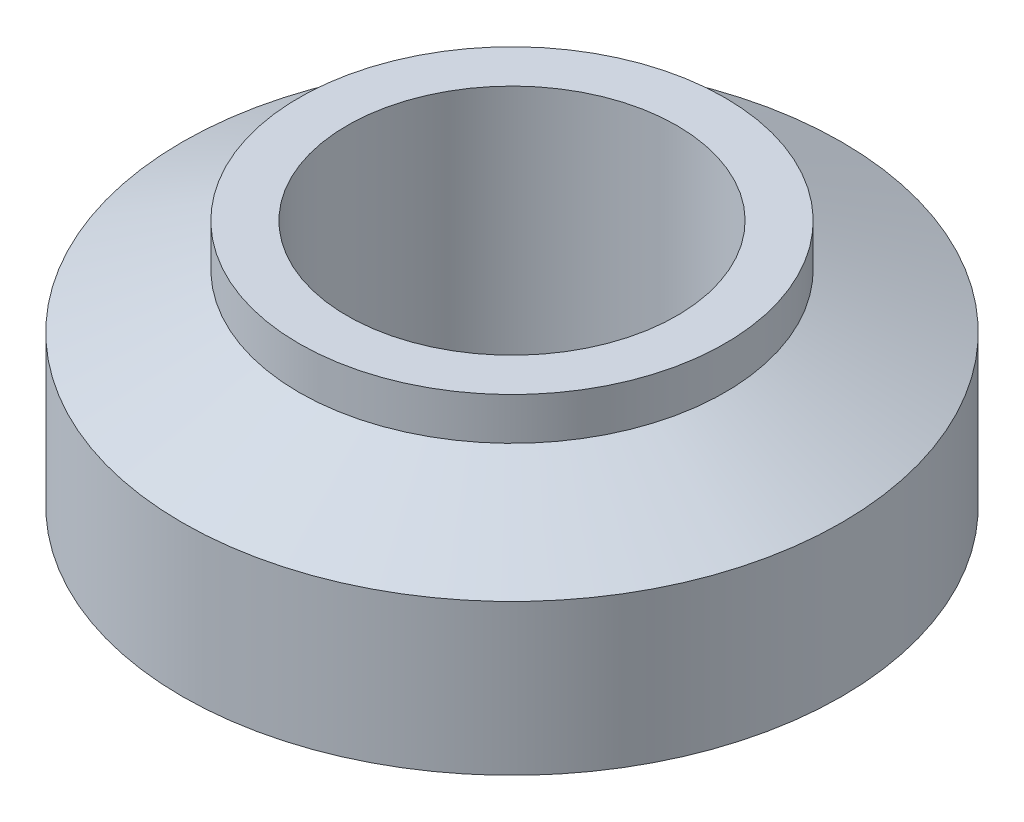
ISO-10303-21;
HEADER;
FILE_DESCRIPTION(('STEP AP214'),'2;1');
FILE_NAME('part.step','',(''),(''),'','','');
FILE_SCHEMA(('AUTOMOTIVE_DESIGN { 1 0 10303 214 1 1 1 1 }'));
ENDSEC;
DATA;
#1=APPLICATION_CONTEXT('core data for automotive mechanical design processes');
#2=APPLICATION_PROTOCOL_DEFINITION('international standard','automotive_design',2000,#1);
#3=PRODUCT_CONTEXT('',#1,'mechanical');
#4=PRODUCT('Part','Part','',(#3));
#5=PRODUCT_RELATED_PRODUCT_CATEGORY('part','',(#4));
#6=PRODUCT_DEFINITION_FORMATION('','',#4);
#7=PRODUCT_DEFINITION_CONTEXT('part definition',#1,'design');
#8=PRODUCT_DEFINITION('design','',#6,#7);
#9=PRODUCT_DEFINITION_SHAPE('','',#8);
#10=(LENGTH_UNIT() NAMED_UNIT(*) SI_UNIT(.MILLI.,.METRE.));
#11=(NAMED_UNIT(*) PLANE_ANGLE_UNIT() SI_UNIT($,.RADIAN.));
#12=(NAMED_UNIT(*) SI_UNIT($,.STERADIAN.) SOLID_ANGLE_UNIT());
#13=UNCERTAINTY_MEASURE_WITH_UNIT(LENGTH_MEASURE(1.E-05),#10,'distance_accuracy_value','');
#14=(GEOMETRIC_REPRESENTATION_CONTEXT(3) GLOBAL_UNCERTAINTY_ASSIGNED_CONTEXT((#13)) GLOBAL_UNIT_ASSIGNED_CONTEXT((#10,
#11,#12)) REPRESENTATION_CONTEXT('',''));
#15=CARTESIAN_POINT('',(0.,0.,0.));
#16=DIRECTION('',(0.,0.,1.));
#17=DIRECTION('',(1.,0.,0.));
#18=AXIS2_PLACEMENT_3D('',#15,#16,#17);
#19=CARTESIAN_POINT('',(0.,-2.00109969766626,-1.29197665484185));
#20=DIRECTION('',(0.,1.,0.));
#21=DIRECTION('',(0.,0.,1.));
#22=AXIS2_PLACEMENT_3D('',#19,#20,#21);
#23=PLANE('',#22);
#24=CARTESIAN_POINT('',(0.,-2.00109969766626,0.));
#25=DIRECTION('',(0.,-1.,0.));
#26=DIRECTION('',(0.,0.,-1.));
#27=AXIS2_PLACEMENT_3D('',#24,#25,#26);
#28=CIRCLE('',#27,1.);
#29=CARTESIAN_POINT('',(0.,-2.00109969766626,-1.));
#30=VERTEX_POINT('',#29);
#31=EDGE_CURVE('E10',#30,#30,#28,.T.);
#32=ORIENTED_EDGE('',*,*,#31,.T.);
#33=EDGE_LOOP('',(#32));
#34=FACE_BOUND('',#33,.T.);
#35=CARTESIAN_POINT('',(0.,-2.00109969766626,0.));
#36=DIRECTION('',(0.,-1.,0.));
#37=DIRECTION('',(0.,0.,-1.));
#38=AXIS2_PLACEMENT_3D('',#35,#36,#37);
#39=CIRCLE('',#38,1.29197665484185);
#40=CARTESIAN_POINT('',(0.,-2.00109969766626,-1.29197665484185));
#41=VERTEX_POINT('',#40);
#42=EDGE_CURVE('E36',#41,#41,#39,.T.);
#43=ORIENTED_EDGE('',*,*,#42,.F.);
#44=EDGE_LOOP('',(#43));
#45=FACE_BOUND('',#44,.T.);
#46=ADVANCED_FACE('F30',(#34,#45),#23,.T.);
#47=CARTESIAN_POINT('',(0.,0.,0.));
#48=DIRECTION('',(0.,-1.,0.));
#49=DIRECTION('',(0.,0.,-1.));
#50=AXIS2_PLACEMENT_3D('',#47,#48,#49);
#51=CYLINDRICAL_SURFACE('',#50,1.29197665484185);
#52=ORIENTED_EDGE('',*,*,#42,.T.);
#53=EDGE_LOOP('',(#52));
#54=FACE_BOUND('',#53,.T.);
#55=CARTESIAN_POINT('',(0.,-2.25752548675395,0.));
#56=DIRECTION('',(0.,-1.,0.));
#57=DIRECTION('',(0.,0.,-1.));
#58=AXIS2_PLACEMENT_3D('',#55,#56,#57);
#59=CIRCLE('',#58,1.29197665484185);
#60=CARTESIAN_POINT('',(0.,-2.25752548675395,-1.29197665484185));
#61=VERTEX_POINT('',#60);
#62=EDGE_CURVE('E40',#61,#61,#59,.T.);
#63=ORIENTED_EDGE('',*,*,#62,.F.);
#64=EDGE_LOOP('',(#63));
#65=FACE_BOUND('',#64,.T.);
#66=ADVANCED_FACE('F73',(#54,#65),#51,.T.);
#67=CARTESIAN_POINT('',(0.,-2.58768219475371,0.));
#68=DIRECTION('',(0.,-1.,0.));
#69=DIRECTION('',(0.,0.,-1.));
#70=AXIS2_PLACEMENT_3D('',#67,#68,#69);
#71=CONICAL_SURFACE('',#70,2.,1.13446401379632);
#72=ORIENTED_EDGE('',*,*,#62,.T.);
#73=EDGE_LOOP('',(#72));
#74=FACE_BOUND('',#73,.T.);
#75=CARTESIAN_POINT('',(0.,-2.58768219475371,0.));
#76=DIRECTION('',(0.,-1.,0.));
#77=DIRECTION('',(0.,0.,-1.));
#78=AXIS2_PLACEMENT_3D('',#75,#76,#77);
#79=CIRCLE('',#78,2.);
#80=CARTESIAN_POINT('',(0.,-2.58768219475371,-2.));
#81=VERTEX_POINT('',#80);
#82=EDGE_CURVE('E44',#81,#81,#79,.T.);
#83=ORIENTED_EDGE('',*,*,#82,.F.);
#84=EDGE_LOOP('',(#83));
#85=FACE_BOUND('',#84,.T.);
#86=ADVANCED_FACE('F69',(#74,#85),#71,.T.);
#87=CARTESIAN_POINT('',(0.,0.,0.));
#88=DIRECTION('',(0.,-1.,0.));
#89=DIRECTION('',(0.,0.,-1.));
#90=AXIS2_PLACEMENT_3D('',#87,#88,#89);
#91=CYLINDRICAL_SURFACE('',#90,2.);
#92=ORIENTED_EDGE('',*,*,#82,.T.);
#93=EDGE_LOOP('',(#92));
#94=FACE_BOUND('',#93,.T.);
#95=CARTESIAN_POINT('',(0.,-3.50109969766626,0.));
#96=DIRECTION('',(0.,-1.,0.));
#97=DIRECTION('',(0.,0.,-1.));
#98=AXIS2_PLACEMENT_3D('',#95,#96,#97);
#99=CIRCLE('',#98,2.);
#100=CARTESIAN_POINT('',(0.,-3.50109969766626,-2.));
#101=VERTEX_POINT('',#100);
#102=EDGE_CURVE('E49',#101,#101,#99,.T.);
#103=ORIENTED_EDGE('',*,*,#102,.F.);
#104=EDGE_LOOP('',(#103));
#105=FACE_BOUND('',#104,.T.);
#106=ADVANCED_FACE('F61',(#94,#105),#91,.T.);
#107=CARTESIAN_POINT('',(0.,-3.50109969766626,-2.));
#108=DIRECTION('',(0.,-1.,0.));
#109=DIRECTION('',(0.,0.,-1.));
#110=AXIS2_PLACEMENT_3D('',#107,#108,#109);
#111=PLANE('',#110);
#112=ORIENTED_EDGE('',*,*,#102,.T.);
#113=EDGE_LOOP('',(#112));
#114=FACE_BOUND('',#113,.T.);
#115=CARTESIAN_POINT('',(0.,-3.50109969766626,0.));
#116=DIRECTION('',(0.,-1.,0.));
#117=DIRECTION('',(0.,0.,-1.));
#118=AXIS2_PLACEMENT_3D('',#115,#116,#117);
#119=CIRCLE('',#118,1.);
#120=CARTESIAN_POINT('',(0.,-3.50109969766626,-1.));
#121=VERTEX_POINT('',#120);
#122=EDGE_CURVE('E52',#121,#121,#119,.T.);
#123=ORIENTED_EDGE('',*,*,#122,.F.);
#124=EDGE_LOOP('',(#123));
#125=FACE_BOUND('',#124,.T.);
#126=ADVANCED_FACE('F59',(#114,#125),#111,.T.);
#127=CARTESIAN_POINT('',(0.,0.,0.));
#128=DIRECTION('',(0.,-1.,0.));
#129=DIRECTION('',(0.,0.,-1.));
#130=AXIS2_PLACEMENT_3D('',#127,#128,#129);
#131=CYLINDRICAL_SURFACE('',#130,1.);
#132=ORIENTED_EDGE('',*,*,#122,.T.);
#133=EDGE_LOOP('',(#132));
#134=FACE_BOUND('',#133,.T.);
#135=ORIENTED_EDGE('',*,*,#31,.F.);
#136=EDGE_LOOP('',(#135));
#137=FACE_BOUND('',#136,.T.);
#138=ADVANCED_FACE('F56',(#134,#137),#131,.F.);
#139=CLOSED_SHELL('',(#46,#66,#86,#106,#126,#138));
#140=MANIFOLD_SOLID_BREP('B2',#139);
#141=ADVANCED_BREP_SHAPE_REPRESENTATION('',(#18,#140),#14);
#142=SHAPE_DEFINITION_REPRESENTATION(#9,#141);
ENDSEC;
END-ISO-10303-21;
